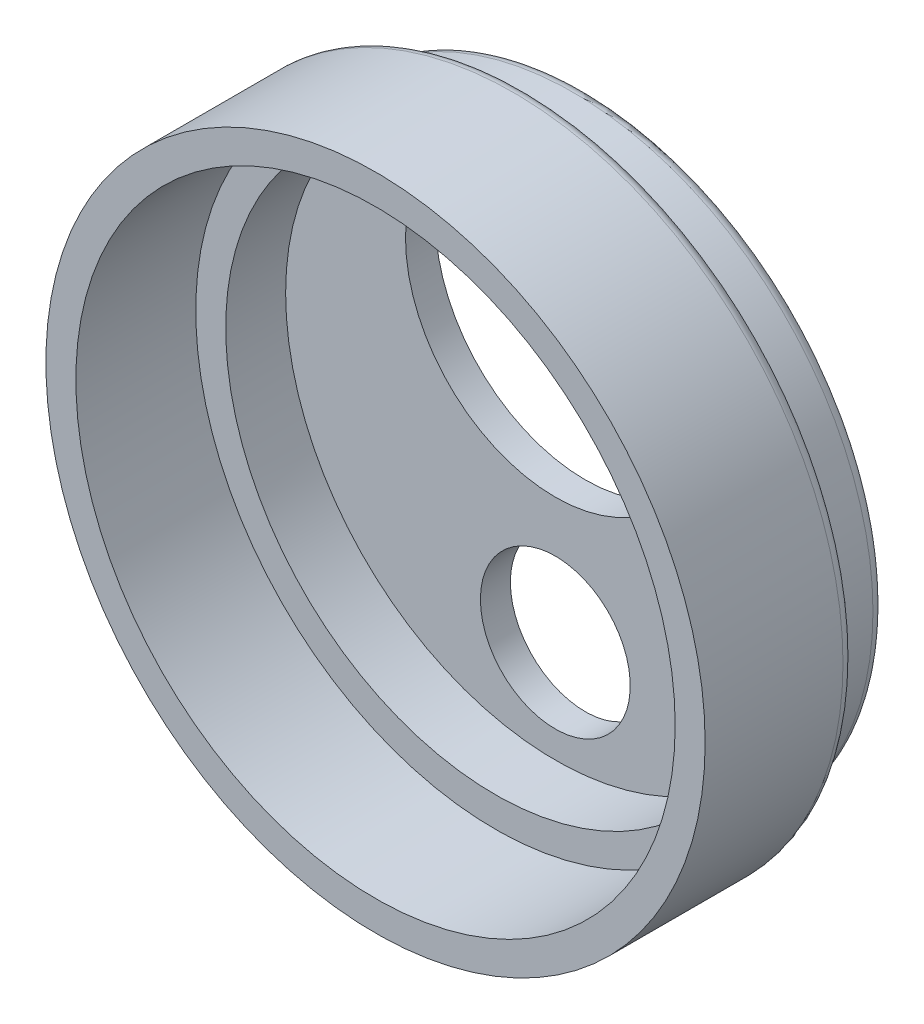
ISO-10303-21;
HEADER;
FILE_DESCRIPTION(('STEP AP214'),'2;1');
FILE_NAME('part.step','',(''),(''),'','','');
FILE_SCHEMA(('AUTOMOTIVE_DESIGN { 1 0 10303 214 1 1 1 1 }'));
ENDSEC;
DATA;
#1=APPLICATION_CONTEXT('core data for automotive mechanical design processes');
#2=APPLICATION_PROTOCOL_DEFINITION('international standard','automotive_design',2000,#1);
#3=PRODUCT_CONTEXT('',#1,'mechanical');
#4=PRODUCT('Part','Part','',(#3));
#5=PRODUCT_RELATED_PRODUCT_CATEGORY('part','',(#4));
#6=PRODUCT_DEFINITION_FORMATION('','',#4);
#7=PRODUCT_DEFINITION_CONTEXT('part definition',#1,'design');
#8=PRODUCT_DEFINITION('design','',#6,#7);
#9=PRODUCT_DEFINITION_SHAPE('','',#8);
#10=(LENGTH_UNIT() NAMED_UNIT(*) SI_UNIT(.MILLI.,.METRE.));
#11=(NAMED_UNIT(*) PLANE_ANGLE_UNIT() SI_UNIT($,.RADIAN.));
#12=(NAMED_UNIT(*) SI_UNIT($,.STERADIAN.) SOLID_ANGLE_UNIT());
#13=UNCERTAINTY_MEASURE_WITH_UNIT(LENGTH_MEASURE(1.E-05),#10,'distance_accuracy_value','');
#14=(GEOMETRIC_REPRESENTATION_CONTEXT(3) GLOBAL_UNCERTAINTY_ASSIGNED_CONTEXT((#13)) GLOBAL_UNIT_ASSIGNED_CONTEXT((#10,
#11,#12)) REPRESENTATION_CONTEXT('',''));
#15=CARTESIAN_POINT('',(0.,0.,0.));
#16=DIRECTION('',(0.,0.,1.));
#17=DIRECTION('',(1.,0.,0.));
#18=AXIS2_PLACEMENT_3D('',#15,#16,#17);
#19=CARTESIAN_POINT('',(0.,0.,25.));
#20=DIRECTION('',(0.,0.,-1.));
#21=DIRECTION('',(-1.,0.,0.));
#22=AXIS2_PLACEMENT_3D('',#19,#20,#21);
#23=CYLINDRICAL_SURFACE('',#22,55.);
#24=CARTESIAN_POINT('',(0.,0.,2.));
#25=DIRECTION('',(0.,0.,1.));
#26=DIRECTION('',(1.,0.,0.));
#27=AXIS2_PLACEMENT_3D('',#24,#25,#26);
#28=CIRCLE('',#27,55.);
#29=CARTESIAN_POINT('',(55.0000000000002,0.,2.));
#30=VERTEX_POINT('',#29);
#31=EDGE_CURVE('E56',#30,#30,#28,.T.);
#32=ORIENTED_EDGE('',*,*,#31,.T.);
#33=EDGE_LOOP('',(#32));
#34=FACE_BOUND('',#33,.T.);
#35=CARTESIAN_POINT('',(0.,0.,25.));
#36=DIRECTION('',(0.,0.,1.));
#37=DIRECTION('',(1.,0.,0.));
#38=AXIS2_PLACEMENT_3D('',#35,#36,#37);
#39=CIRCLE('',#38,55.);
#40=CARTESIAN_POINT('',(55.0000000000002,0.,25.));
#41=VERTEX_POINT('',#40);
#42=EDGE_CURVE('E86',#41,#41,#39,.T.);
#43=ORIENTED_EDGE('',*,*,#42,.F.);
#44=EDGE_LOOP('',(#43));
#45=FACE_BOUND('',#44,.T.);
#46=ADVANCED_FACE('F48',(#34,#45),#23,.T.);
#47=CARTESIAN_POINT('',(0.,0.,25.));
#48=DIRECTION('',(0.,0.,1.));
#49=DIRECTION('',(1.,0.,0.));
#50=AXIS2_PLACEMENT_3D('',#47,#48,#49);
#51=PLANE('',#50);
#52=CARTESIAN_POINT('',(0.,0.,25.));
#53=DIRECTION('',(0.,0.,1.));
#54=DIRECTION('',(1.,0.,0.));
#55=AXIS2_PLACEMENT_3D('',#52,#53,#54);
#56=CIRCLE('',#55,50.);
#57=CARTESIAN_POINT('',(50.0000000000002,0.,25.));
#58=VERTEX_POINT('',#57);
#59=EDGE_CURVE('E82',#58,#58,#56,.T.);
#60=ORIENTED_EDGE('',*,*,#59,.F.);
#61=EDGE_LOOP('',(#60));
#62=FACE_BOUND('',#61,.T.);
#63=ORIENTED_EDGE('',*,*,#42,.T.);
#64=EDGE_LOOP('',(#63));
#65=FACE_BOUND('',#64,.T.);
#66=ADVANCED_FACE('F121',(#62,#65),#51,.T.);
#67=CARTESIAN_POINT('',(0.,0.,0.));
#68=DIRECTION('',(0.,0.,1.));
#69=DIRECTION('',(1.,0.,0.));
#70=AXIS2_PLACEMENT_3D('',#67,#68,#69);
#71=PLANE('',#70);
#72=CARTESIAN_POINT('',(0.,0.,0.));
#73=DIRECTION('',(0.,0.,1.));
#74=DIRECTION('',(1.,0.,0.));
#75=AXIS2_PLACEMENT_3D('',#72,#73,#74);
#76=CIRCLE('',#75,53.);
#77=CARTESIAN_POINT('',(53.0000000000002,0.,0.));
#78=VERTEX_POINT('',#77);
#79=EDGE_CURVE('E12',#78,#78,#76,.F.);
#80=ORIENTED_EDGE('',*,*,#79,.T.);
#81=EDGE_LOOP('',(#80));
#82=FACE_BOUND('',#81,.T.);
#83=CARTESIAN_POINT('',(0.,0.,0.));
#84=DIRECTION('',(0.,0.,1.));
#85=DIRECTION('',(1.,0.,0.));
#86=AXIS2_PLACEMENT_3D('',#83,#84,#85);
#87=CIRCLE('',#86,52.);
#88=CARTESIAN_POINT('',(52.0000000000002,0.,0.));
#89=VERTEX_POINT('',#88);
#90=EDGE_CURVE('E99',#89,#89,#87,.T.);
#91=ORIENTED_EDGE('',*,*,#90,.T.);
#92=EDGE_LOOP('',(#91));
#93=FACE_BOUND('',#92,.T.);
#94=ADVANCED_FACE('F127',(#82,#93),#71,.F.);
#95=CARTESIAN_POINT('',(0.,0.,-10.));
#96=DIRECTION('',(0.,0.,1.));
#97=DIRECTION('',(1.,0.,0.));
#98=AXIS2_PLACEMENT_3D('',#95,#96,#97);
#99=CYLINDRICAL_SURFACE('',#98,50.);
#100=CARTESIAN_POINT('',(0.,0.,-2.));
#101=DIRECTION('',(0.,0.,1.));
#102=DIRECTION('',(1.,0.,0.));
#103=AXIS2_PLACEMENT_3D('',#100,#101,#102);
#104=CIRCLE('',#103,50.);
#105=CARTESIAN_POINT('',(50.0000000000002,0.,-2.));
#106=VERTEX_POINT('',#105);
#107=EDGE_CURVE('E96',#106,#106,#104,.F.);
#108=ORIENTED_EDGE('',*,*,#107,.T.);
#109=EDGE_LOOP('',(#108));
#110=FACE_BOUND('',#109,.T.);
#111=CARTESIAN_POINT('',(0.,0.,-8.));
#112=DIRECTION('',(0.,0.,-1.));
#113=DIRECTION('',(-1.,0.,0.));
#114=AXIS2_PLACEMENT_3D('',#111,#112,#113);
#115=CIRCLE('',#114,50.);
#116=CARTESIAN_POINT('',(-50.0000000000002,0.,-8.));
#117=VERTEX_POINT('',#116);
#118=EDGE_CURVE('E93',#117,#117,#115,.F.);
#119=ORIENTED_EDGE('',*,*,#118,.T.);
#120=EDGE_LOOP('',(#119));
#121=FACE_BOUND('',#120,.T.);
#122=ADVANCED_FACE('F133',(#110,#121),#99,.T.);
#123=CARTESIAN_POINT('',(0.,0.,-10.));
#124=DIRECTION('',(0.,0.,-1.));
#125=DIRECTION('',(-1.,0.,0.));
#126=AXIS2_PLACEMENT_3D('',#123,#124,#125);
#127=PLANE('',#126);
#128=CARTESIAN_POINT('',(0.,18.,-10.));
#129=DIRECTION('',(0.,0.,-1.));
#130=DIRECTION('',(-1.,0.,0.));
#131=AXIS2_PLACEMENT_3D('',#128,#129,#130);
#132=CIRCLE('',#131,25.);
#133=CARTESIAN_POINT('',(-25.0000000000001,18.,-10.));
#134=VERTEX_POINT('',#133);
#135=EDGE_CURVE('E66',#134,#134,#132,.T.);
#136=ORIENTED_EDGE('',*,*,#135,.F.);
#137=EDGE_LOOP('',(#136));
#138=FACE_BOUND('',#137,.T.);
#139=CARTESIAN_POINT('',(0.,-28.0000000000002,-10.));
#140=DIRECTION('',(0.,0.,-1.));
#141=DIRECTION('',(-1.,0.,0.));
#142=AXIS2_PLACEMENT_3D('',#139,#140,#141);
#143=CIRCLE('',#142,12.5);
#144=CARTESIAN_POINT('',(-12.5000000000001,-28.0000000000002,-10.));
#145=VERTEX_POINT('',#144);
#146=EDGE_CURVE('E72',#145,#145,#143,.T.);
#147=ORIENTED_EDGE('',*,*,#146,.F.);
#148=EDGE_LOOP('',(#147));
#149=FACE_BOUND('',#148,.T.);
#150=CARTESIAN_POINT('',(0.,0.,-10.));
#151=DIRECTION('',(0.,0.,-1.));
#152=DIRECTION('',(-1.,0.,0.));
#153=AXIS2_PLACEMENT_3D('',#150,#151,#152);
#154=CIRCLE('',#153,48.);
#155=CARTESIAN_POINT('',(-48.0000000000002,0.,-10.));
#156=VERTEX_POINT('',#155);
#157=EDGE_CURVE('E61',#156,#156,#154,.T.);
#158=ORIENTED_EDGE('',*,*,#157,.T.);
#159=EDGE_LOOP('',(#158));
#160=FACE_BOUND('',#159,.T.);
#161=ADVANCED_FACE('F104',(#138,#149,#160),#127,.T.);
#162=CARTESIAN_POINT('',(0.,0.,25.));
#163=DIRECTION('',(0.,0.,-1.));
#164=DIRECTION('',(-1.,0.,0.));
#165=AXIS2_PLACEMENT_3D('',#162,#163,#164);
#166=CYLINDRICAL_SURFACE('',#165,50.);
#167=ORIENTED_EDGE('',*,*,#59,.T.);
#168=EDGE_LOOP('',(#167));
#169=FACE_BOUND('',#168,.T.);
#170=CARTESIAN_POINT('',(0.,0.,5.));
#171=DIRECTION('',(0.,0.,1.));
#172=DIRECTION('',(1.,0.,0.));
#173=AXIS2_PLACEMENT_3D('',#170,#171,#172);
#174=CIRCLE('',#173,50.);
#175=CARTESIAN_POINT('',(50.0000000000002,0.,5.));
#176=VERTEX_POINT('',#175);
#177=EDGE_CURVE('E79',#176,#176,#174,.T.);
#178=ORIENTED_EDGE('',*,*,#177,.F.);
#179=EDGE_LOOP('',(#178));
#180=FACE_BOUND('',#179,.T.);
#181=ADVANCED_FACE('F140',(#169,#180),#166,.F.);
#182=CARTESIAN_POINT('',(0.,0.,5.));
#183=DIRECTION('',(0.,0.,1.));
#184=DIRECTION('',(1.,0.,0.));
#185=AXIS2_PLACEMENT_3D('',#182,#183,#184);
#186=PLANE('',#185);
#187=CARTESIAN_POINT('',(0.,0.,5.));
#188=DIRECTION('',(0.,0.,1.));
#189=DIRECTION('',(1.,0.,0.));
#190=AXIS2_PLACEMENT_3D('',#187,#188,#189);
#191=CIRCLE('',#190,45.);
#192=CARTESIAN_POINT('',(45.0000000000002,0.,5.));
#193=VERTEX_POINT('',#192);
#194=EDGE_CURVE('E83',#193,#193,#191,.F.);
#195=ORIENTED_EDGE('',*,*,#194,.T.);
#196=EDGE_LOOP('',(#195));
#197=FACE_BOUND('',#196,.T.);
#198=ORIENTED_EDGE('',*,*,#177,.T.);
#199=EDGE_LOOP('',(#198));
#200=FACE_BOUND('',#199,.T.);
#201=ADVANCED_FACE('F148',(#197,#200),#186,.T.);
#202=CARTESIAN_POINT('',(0.,0.,-10.));
#203=DIRECTION('',(0.,0.,1.));
#204=DIRECTION('',(1.,0.,0.));
#205=AXIS2_PLACEMENT_3D('',#202,#203,#204);
#206=CYLINDRICAL_SURFACE('',#205,45.);
#207=CARTESIAN_POINT('',(0.,0.,-5.));
#208=DIRECTION('',(0.,0.,-1.));
#209=DIRECTION('',(-1.,0.,0.));
#210=AXIS2_PLACEMENT_3D('',#207,#208,#209);
#211=CIRCLE('',#210,45.);
#212=CARTESIAN_POINT('',(-45.0000000000002,0.,-5.));
#213=VERTEX_POINT('',#212);
#214=EDGE_CURVE('E70',#213,#213,#211,.T.);
#215=ORIENTED_EDGE('',*,*,#214,.T.);
#216=EDGE_LOOP('',(#215));
#217=FACE_BOUND('',#216,.T.);
#218=ORIENTED_EDGE('',*,*,#194,.F.);
#219=EDGE_LOOP('',(#218));
#220=FACE_BOUND('',#219,.T.);
#221=ADVANCED_FACE('F144',(#217,#220),#206,.F.);
#222=CARTESIAN_POINT('',(0.,0.,-5.));
#223=DIRECTION('',(0.,0.,-1.));
#224=DIRECTION('',(-1.,0.,0.));
#225=AXIS2_PLACEMENT_3D('',#222,#223,#224);
#226=PLANE('',#225);
#227=CARTESIAN_POINT('',(0.,18.,-5.));
#228=DIRECTION('',(0.,0.,-1.));
#229=DIRECTION('',(-1.,0.,0.));
#230=AXIS2_PLACEMENT_3D('',#227,#228,#229);
#231=CIRCLE('',#230,25.);
#232=CARTESIAN_POINT('',(-25.0000000000001,18.,-5.));
#233=VERTEX_POINT('',#232);
#234=EDGE_CURVE('E52',#233,#233,#231,.T.);
#235=ORIENTED_EDGE('',*,*,#234,.T.);
#236=EDGE_LOOP('',(#235));
#237=FACE_BOUND('',#236,.T.);
#238=CARTESIAN_POINT('',(0.,-28.0000000000002,-5.));
#239=DIRECTION('',(0.,0.,-1.));
#240=DIRECTION('',(-1.,0.,0.));
#241=AXIS2_PLACEMENT_3D('',#238,#239,#240);
#242=CIRCLE('',#241,12.5);
#243=CARTESIAN_POINT('',(-12.5000000000001,-28.0000000000002,-5.));
#244=VERTEX_POINT('',#243);
#245=EDGE_CURVE('E64',#244,#244,#242,.T.);
#246=ORIENTED_EDGE('',*,*,#245,.T.);
#247=EDGE_LOOP('',(#246));
#248=FACE_BOUND('',#247,.T.);
#249=ORIENTED_EDGE('',*,*,#214,.F.);
#250=EDGE_LOOP('',(#249));
#251=FACE_BOUND('',#250,.T.);
#252=ADVANCED_FACE('F116',(#237,#248,#251),#226,.F.);
#253=CARTESIAN_POINT('',(0.,0.,-2.));
#254=DIRECTION('',(0.,0.,1.));
#255=DIRECTION('',(1.,0.,0.));
#256=AXIS2_PLACEMENT_3D('',#253,#254,#255);
#257=TOROIDAL_SURFACE('',#256,52.,2.);
#258=ORIENTED_EDGE('',*,*,#90,.F.);
#259=EDGE_LOOP('',(#258));
#260=FACE_BOUND('',#259,.T.);
#261=ORIENTED_EDGE('',*,*,#107,.F.);
#262=EDGE_LOOP('',(#261));
#263=FACE_BOUND('',#262,.T.);
#264=ADVANCED_FACE('F108',(#260,#263),#257,.F.);
#265=CARTESIAN_POINT('',(0.,0.,-8.));
#266=DIRECTION('',(0.,0.,-1.));
#267=DIRECTION('',(-1.,0.,0.));
#268=AXIS2_PLACEMENT_3D('',#265,#266,#267);
#269=TOROIDAL_SURFACE('',#268,48.,2.);
#270=ORIENTED_EDGE('',*,*,#118,.F.);
#271=EDGE_LOOP('',(#270));
#272=FACE_BOUND('',#271,.T.);
#273=ORIENTED_EDGE('',*,*,#157,.F.);
#274=EDGE_LOOP('',(#273));
#275=FACE_BOUND('',#274,.T.);
#276=ADVANCED_FACE('F106',(#272,#275),#269,.T.);
#277=CARTESIAN_POINT('',(0.,0.,2.));
#278=DIRECTION('',(0.,0.,1.));
#279=DIRECTION('',(1.,0.,0.));
#280=AXIS2_PLACEMENT_3D('',#277,#278,#279);
#281=TOROIDAL_SURFACE('',#280,53.,2.);
#282=ORIENTED_EDGE('',*,*,#79,.F.);
#283=EDGE_LOOP('',(#282));
#284=FACE_BOUND('',#283,.T.);
#285=ORIENTED_EDGE('',*,*,#31,.F.);
#286=EDGE_LOOP('',(#285));
#287=FACE_BOUND('',#286,.T.);
#288=ADVANCED_FACE('F50',(#284,#287),#281,.T.);
#289=CARTESIAN_POINT('',(0.,-28.0000000000002,25.));
#290=DIRECTION('',(0.,0.,-1.));
#291=DIRECTION('',(-1.,0.,0.));
#292=AXIS2_PLACEMENT_3D('',#289,#290,#291);
#293=CYLINDRICAL_SURFACE('',#292,12.5);
#294=ORIENTED_EDGE('',*,*,#146,.T.);
#295=EDGE_LOOP('',(#294));
#296=FACE_BOUND('',#295,.T.);
#297=ORIENTED_EDGE('',*,*,#245,.F.);
#298=EDGE_LOOP('',(#297));
#299=FACE_BOUND('',#298,.T.);
#300=ADVANCED_FACE('F114',(#296,#299),#293,.F.);
#301=CARTESIAN_POINT('',(0.,18.,25.));
#302=DIRECTION('',(0.,0.,-1.));
#303=DIRECTION('',(-1.,0.,0.));
#304=AXIS2_PLACEMENT_3D('',#301,#302,#303);
#305=CYLINDRICAL_SURFACE('',#304,25.);
#306=ORIENTED_EDGE('',*,*,#135,.T.);
#307=EDGE_LOOP('',(#306));
#308=FACE_BOUND('',#307,.T.);
#309=ORIENTED_EDGE('',*,*,#234,.F.);
#310=EDGE_LOOP('',(#309));
#311=FACE_BOUND('',#310,.T.);
#312=ADVANCED_FACE('F158',(#308,#311),#305,.F.);
#313=CLOSED_SHELL('',(#46,#66,#94,#122,#161,#181,#201,#221,#252,#264,#276,#288,#300,#312));
#314=MANIFOLD_SOLID_BREP('B2',#313);
#315=ADVANCED_BREP_SHAPE_REPRESENTATION('',(#18,#314),#14);
#316=SHAPE_DEFINITION_REPRESENTATION(#9,#315);
ENDSEC;
END-ISO-10303-21;
